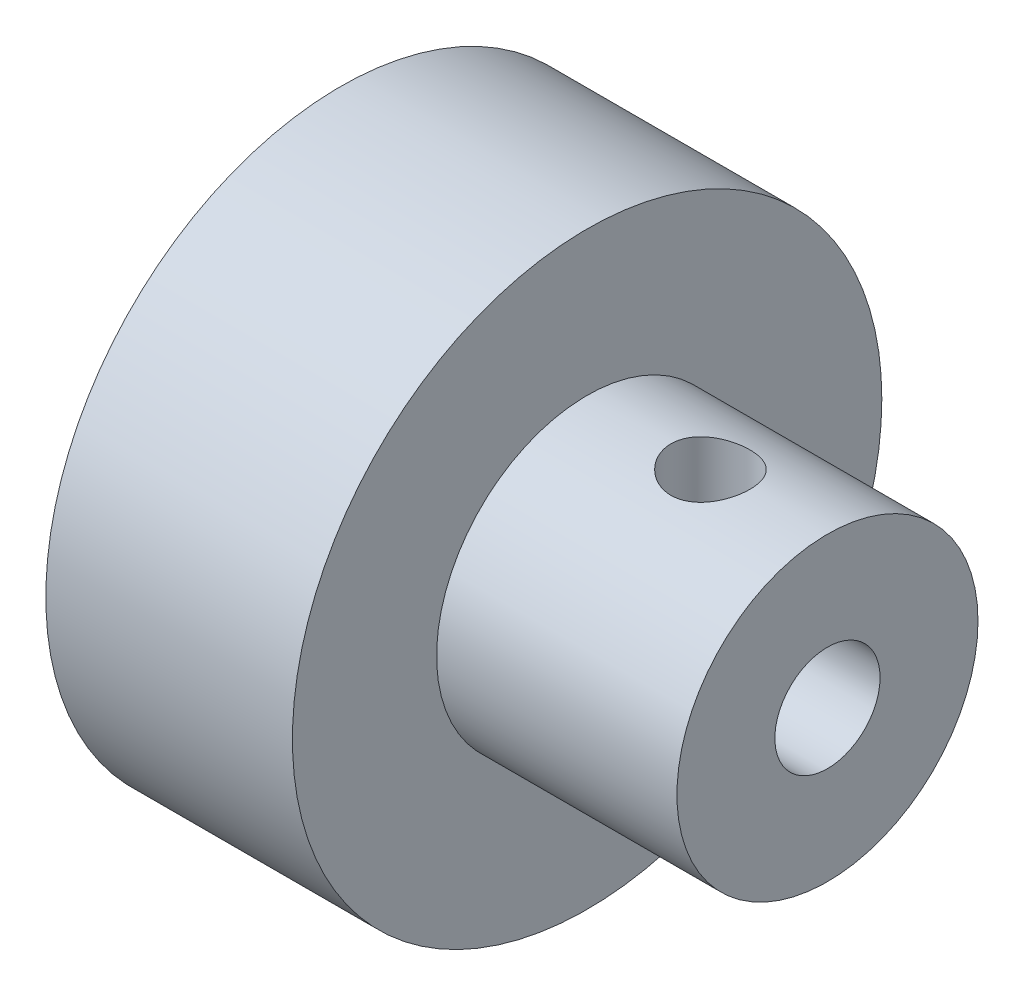
ISO-10303-21;
HEADER;
FILE_DESCRIPTION(('STEP AP214'),'2;1');
FILE_NAME('part.step','',(''),(''),'','','');
FILE_SCHEMA(('AUTOMOTIVE_DESIGN { 1 0 10303 214 1 1 1 1 }'));
ENDSEC;
DATA;
#1=APPLICATION_CONTEXT('core data for automotive mechanical design processes');
#2=APPLICATION_PROTOCOL_DEFINITION('international standard','automotive_design',2000,#1);
#3=PRODUCT_CONTEXT('',#1,'mechanical');
#4=PRODUCT('Part','Part','',(#3));
#5=PRODUCT_RELATED_PRODUCT_CATEGORY('part','',(#4));
#6=PRODUCT_DEFINITION_FORMATION('','',#4);
#7=PRODUCT_DEFINITION_CONTEXT('part definition',#1,'design');
#8=PRODUCT_DEFINITION('design','',#6,#7);
#9=PRODUCT_DEFINITION_SHAPE('','',#8);
#10=(LENGTH_UNIT() NAMED_UNIT(*) SI_UNIT(.MILLI.,.METRE.));
#11=(NAMED_UNIT(*) PLANE_ANGLE_UNIT() SI_UNIT($,.RADIAN.));
#12=(NAMED_UNIT(*) SI_UNIT($,.STERADIAN.) SOLID_ANGLE_UNIT());
#13=UNCERTAINTY_MEASURE_WITH_UNIT(LENGTH_MEASURE(1.E-05),#10,'distance_accuracy_value','');
#14=(GEOMETRIC_REPRESENTATION_CONTEXT(3) GLOBAL_UNCERTAINTY_ASSIGNED_CONTEXT((#13)) GLOBAL_UNIT_ASSIGNED_CONTEXT((#10,
#11,#12)) REPRESENTATION_CONTEXT('',''));
#15=CARTESIAN_POINT('',(0.,0.,0.));
#16=DIRECTION('',(0.,0.,1.));
#17=DIRECTION('',(1.,0.,0.));
#18=AXIS2_PLACEMENT_3D('',#15,#16,#17);
#19=CARTESIAN_POINT('',(-14.6892880689265,0.,0.));
#20=DIRECTION('',(1.,0.,0.));
#21=DIRECTION('',(0.,0.,-1.));
#22=AXIS2_PLACEMENT_3D('',#19,#20,#21);
#23=PLANE('',#22);
#24=CARTESIAN_POINT('',(-14.6892880689265,0.,0.));
#25=DIRECTION('',(1.,0.,0.));
#26=DIRECTION('',(0.,0.,-1.));
#27=AXIS2_PLACEMENT_3D('',#24,#25,#26);
#28=CIRCLE('',#27,8.89);
#29=CARTESIAN_POINT('',(-14.6892880689265,0.,-8.89));
#30=VERTEX_POINT('',#29);
#31=EDGE_CURVE('E122',#30,#30,#28,.T.);
#32=ORIENTED_EDGE('',*,*,#31,.F.);
#33=EDGE_LOOP('',(#32));
#34=FACE_BOUND('',#33,.T.);
#35=CARTESIAN_POINT('',(-14.6892880689265,0.,0.));
#36=DIRECTION('',(1.,0.,0.));
#37=DIRECTION('',(0.,0.,-1.));
#38=AXIS2_PLACEMENT_3D('',#35,#36,#37);
#39=CIRCLE('',#38,1.5875);
#40=CARTESIAN_POINT('',(-14.6892880689265,0.,-1.5875));
#41=VERTEX_POINT('',#40);
#42=EDGE_CURVE('E10',#41,#41,#39,.T.);
#43=ORIENTED_EDGE('',*,*,#42,.T.);
#44=EDGE_LOOP('',(#43));
#45=FACE_BOUND('',#44,.T.);
#46=ADVANCED_FACE('F45',(#34,#45),#23,.F.);
#47=CARTESIAN_POINT('',(0.,0.,0.));
#48=DIRECTION('',(1.,0.,0.));
#49=DIRECTION('',(0.,0.,-1.));
#50=AXIS2_PLACEMENT_3D('',#47,#48,#49);
#51=CYLINDRICAL_SURFACE('',#50,1.5875);
#52=CARTESIAN_POINT('',(-3.52955632665525,-1.05003255157876,1.190625));
#53=CARTESIAN_POINT('',(-3.47399587181116,-1.050045445975,1.19061880120499));
#54=CARTESIAN_POINT('',(-3.41839494567017,-1.05454741000987,1.18668886577821));
#55=CARTESIAN_POINT('',(-3.30942575328898,-1.07148823701036,1.17140301985762));
#56=CARTESIAN_POINT('',(-3.25606464842102,-1.08395075602632,1.16002497361435));
#57=CARTESIAN_POINT('',(-3.15365232330667,-1.11422757784016,1.13096547199778));
#58=CARTESIAN_POINT('',(-3.10455179760005,-1.13196567044321,1.11337314984434));
#59=CARTESIAN_POINT('',(-3.01016962218938,-1.17067373681068,1.0725995764387));
#60=CARTESIAN_POINT('',(-2.96488751182031,-1.19164331985289,1.04941900067592));
#61=CARTESIAN_POINT('',(-2.86906679457896,-1.2396574216291,0.992504284125244));
#62=CARTESIAN_POINT('',(-2.81941365386299,-1.26705442557768,0.957576618231006));
#63=CARTESIAN_POINT('',(-2.72586423782545,-1.321761740015,0.880535424277007));
#64=CARTESIAN_POINT('',(-2.68197661082916,-1.34907186163527,0.83841131436972));
#65=CARTESIAN_POINT('',(-2.59224970284748,-1.40702174808774,0.737878090100433));
#66=CARTESIAN_POINT('',(-2.54784159057137,-1.43720281226121,0.677900035756593));
#67=CARTESIAN_POINT('',(-2.47019994883075,-1.49131980240358,0.548631836139916));
#68=CARTESIAN_POINT('',(-2.43694016553939,-1.51527037067959,0.479364114482458));
#69=CARTESIAN_POINT('',(-2.39194772596979,-1.54808443073509,0.355496037787019));
#70=CARTESIAN_POINT('',(-2.37674788172235,-1.55931958043549,0.302772801943451));
#71=CARTESIAN_POINT('',(-2.35370292208284,-1.57643223525434,0.194907383645006));
#72=CARTESIAN_POINT('',(-2.34585141687053,-1.58231439499439,0.139767346508667));
#73=CARTESIAN_POINT('',(-2.3379615754019,-1.58822529365106,0.0284679172687354));
#74=CARTESIAN_POINT('',(-2.33794354099396,-1.58823882295637,-0.0276937463004187));
#75=CARTESIAN_POINT('',(-2.34577181397461,-1.58237401411808,-0.139157199360015));
#76=CARTESIAN_POINT('',(-2.35361994258859,-1.57649431153499,-0.194458786708892));
#77=CARTESIAN_POINT('',(-2.37630191056096,-1.55965031243376,-0.300743297572916));
#78=CARTESIAN_POINT('',(-2.390887285725,-1.54886705851508,-0.351809262912558));
#79=CARTESIAN_POINT('',(-2.4262403676374,-1.52306558684007,-0.450596385005576));
#80=CARTESIAN_POINT('',(-2.44700942243758,-1.50804644569141,-0.498316809620447));
#81=CARTESIAN_POINT('',(-2.49651420867685,-1.472890802502,-0.594690931730129));
#82=CARTESIAN_POINT('',(-2.52586905334639,-1.45237629107677,-0.642886211616418));
#83=CARTESIAN_POINT('',(-2.59033870418185,-1.40859432596468,-0.733875255122699));
#84=CARTESIAN_POINT('',(-2.62545841877955,-1.38532453106985,-0.776664360293093));
#85=CARTESIAN_POINT('',(-2.70820235978188,-1.33265676661185,-0.864458871498921));
#86=CARTESIAN_POINT('',(-2.75692738711371,-1.30295376843929,-0.908244413225473));
#87=CARTESIAN_POINT('',(-2.86108752740517,-1.24401229387742,-0.987431949727556));
#88=CARTESIAN_POINT('',(-2.91652581815327,-1.21477404494797,-1.0228299505536));
#89=CARTESIAN_POINT('',(-3.02233568616272,-1.16537919386833,-1.07849357589208));
#90=CARTESIAN_POINT('',(-3.07155229386264,-1.14456844833299,-1.10036663076556));
#91=CARTESIAN_POINT('',(-3.17400814378189,-1.10757288373056,-1.13759771455097));
#92=CARTESIAN_POINT('',(-3.22723796990948,-1.09137763785656,-1.15297046685305));
#93=CARTESIAN_POINT('',(-3.32610783845392,-1.06870540179809,-1.17397518372094));
#94=CARTESIAN_POINT('',(-3.37116119808551,-1.06093847023265,-1.18093386412912));
#95=CARTESIAN_POINT('',(-3.46236972793073,-1.05120748322927,-1.18960709991958));
#96=CARTESIAN_POINT('',(-3.50852341207812,-1.04923600365031,-1.19132836468154));
#97=CARTESIAN_POINT('',(-3.60058027634364,-1.05142402102457,-1.18939683154219));
#98=CARTESIAN_POINT('',(-3.64648335801668,-1.05558577464436,-1.1857420555772));
#99=CARTESIAN_POINT('',(-3.73678552265678,-1.06934967402693,-1.17334131022126));
#100=CARTESIAN_POINT('',(-3.78118190127656,-1.0789611050858,-1.16458665082263));
#101=CARTESIAN_POINT('',(-3.88383714982548,-1.10670783140942,-1.13834830402645));
#102=CARTESIAN_POINT('',(-3.94106486507531,-1.12668703809744,-1.11882388129336));
#103=CARTESIAN_POINT('',(-4.05050053466959,-1.1710817723223,-1.07226796784258));
#104=CARTESIAN_POINT('',(-4.10269900600796,-1.19550543916301,-1.04522265503785));
#105=CARTESIAN_POINT('',(-4.20372710179345,-1.24704699135672,-0.983216332051275));
#106=CARTESIAN_POINT('',(-4.25237117215349,-1.27422976552798,-0.948008248603961));
#107=CARTESIAN_POINT('',(-4.34394549064199,-1.32832083103686,-0.870605343134578));
#108=CARTESIAN_POINT('',(-4.38687294449647,-1.3552289822489,-0.828407126793555));
#109=CARTESIAN_POINT('',(-4.47513243876106,-1.41255926707429,-0.727261145352264));
#110=CARTESIAN_POINT('',(-4.51894604749847,-1.44246738243752,-0.666667665064069));
#111=CARTESIAN_POINT('',(-4.59526153383188,-1.49584651911049,-0.536219092541945));
#112=CARTESIAN_POINT('',(-4.62778789366665,-1.519331448665,-0.46638450504254));
#113=CARTESIAN_POINT('',(-4.6713164823662,-1.55114153831888,-0.341912306313174));
#114=CARTESIAN_POINT('',(-4.68585703131764,-1.56190535686026,-0.289123483003683));
#115=CARTESIAN_POINT('',(-4.70758355872435,-1.57805648311366,-0.181264294065456));
#116=CARTESIAN_POINT('',(-4.71477611263438,-1.58344859766149,-0.126196014246044));
#117=CARTESIAN_POINT('',(-4.72138496195483,-1.58840143581668,-0.0151984122151932));
#118=CARTESIAN_POINT('',(-4.72078300292542,-1.58794847048757,0.040732624740999));
#119=CARTESIAN_POINT('',(-4.7117985398099,-1.58121987574774,0.151613402505125));
#120=CARTESIAN_POINT('',(-4.70341396297494,-1.57494269517078,0.206562877919334));
#121=CARTESIAN_POINT('',(-4.67971998694751,-1.55736449484373,0.312358036108632));
#122=CARTESIAN_POINT('',(-4.66461868273127,-1.54621460816847,0.363276543980955));
#123=CARTESIAN_POINT('',(-4.62827454957022,-1.51973534456514,0.461693691083551));
#124=CARTESIAN_POINT('',(-4.60703040691447,-1.50440507365769,0.50919159606487));
#125=CARTESIAN_POINT('',(-4.55644821368846,-1.46857753504696,0.605272235896156));
#126=CARTESIAN_POINT('',(-4.52646589988858,-1.44769167461642,0.653368356641274));
#127=CARTESIAN_POINT('',(-4.46073108946535,-1.403234954476,0.744073006806094));
#128=CARTESIAN_POINT('',(-4.42497328955946,-1.37966163294053,0.786676427329301));
#129=CARTESIAN_POINT('',(-4.34076456694763,-1.32640667727172,0.874017021494155));
#130=CARTESIAN_POINT('',(-4.29120199709983,-1.29643919738103,0.917509051614588));
#131=CARTESIAN_POINT('',(-4.18529854458473,-1.2371870295527,0.995959824095465));
#132=CARTESIAN_POINT('',(-4.12895518973873,-1.20790259531751,1.03091544004403));
#133=CARTESIAN_POINT('',(-4.0225677464992,-1.15926871150369,1.0850242722053));
#134=CARTESIAN_POINT('',(-3.97379043413193,-1.13913939849811,1.10595986530786));
#135=CARTESIAN_POINT('',(-3.87239051441715,-1.10357098191916,1.14145534685201));
#136=CARTESIAN_POINT('',(-3.81977855895137,-1.08811945745383,1.15603216594685));
#137=CARTESIAN_POINT('',(-3.72736817735019,-1.06785111060464,1.17472664594127));
#138=CARTESIAN_POINT('',(-3.68833246381845,-1.06124478398383,1.18065747665075));
#139=CARTESIAN_POINT('',(-3.60938984980979,-1.05233228217761,1.18860759763756));
#140=CARTESIAN_POINT('',(-3.56948353840617,-1.05002328532471,1.19062945461798));
#141=CARTESIAN_POINT('',(-3.52955632665525,-1.05003255157876,1.190625));
#142=B_SPLINE_CURVE_WITH_KNOTS('',3,(#52,#53,#54,#55,#56,#57,#58,#59,#60,#61,#62,#63,#64,#65,
#66,#67,#68,#69,#70,#71,#72,#73,#74,#75,#76,#77,#78,#79,#80,#81,#82,#83,#84,#85,#86,#87,#88,#89,
#90,#91,#92,#93,#94,#95,#96,#97,#98,#99,#100,#101,#102,#103,#104,#105,#106,#107,#108,#109,#110,
#111,#112,#113,#114,#115,#116,#117,#118,#119,#120,#121,#122,#123,#124,#125,#126,#127,#128,#129,
#130,#131,#132,#133,#134,#135,#136,#137,#138,#139,#140,#141),.UNSPECIFIED.,.T.,.F.,(4,2,2,2,2,2,
2,2,2,2,2,2,2,2,2,2,2,2,2,2,2,2,2,2,2,2,2,2,2,2,2,2,2,2,2,2,2,2,2,2,2,2,2,2,4),(0.,
0.166474597743314,0.333446217300251,0.498114149835984,0.662762187833673,0.861895093986152,
1.0613233713153,1.30147098182183,1.54104901534439,1.70837006939059,1.87554549222377,
2.04315417765196,2.21080167790273,2.37270731241696,2.53464826848756,2.71412370017785,
2.89375274442082,3.10871804281232,3.32378549783047,3.49646406272525,3.66874938249073,
3.80688854402059,3.9448506680219,4.08286356658931,4.22111232464965,4.41110709885653,
4.60145338469826,4.79856172215235,4.99576605498253,5.23599171487223,5.47569301565586,
5.64239486354326,5.80894740496725,5.97589007623953,6.14287722220568,6.30501670074205,
6.46719088019845,6.64773604163628,6.82844793934811,7.0449089208391,7.26144906140521,
7.43123259464913,7.6005612670708,7.72027294583552,7.83990599300725),.UNSPECIFIED.);
#143=CARTESIAN_POINT('',(-3.52955632665525,-1.05003255157876,1.190625));
#144=VERTEX_POINT('',#143);
#145=EDGE_CURVE('E95',#144,#144,#142,.T.);
#146=ORIENTED_EDGE('',*,*,#145,.F.);
#147=EDGE_LOOP('',(#146));
#148=FACE_BOUND('',#147,.T.);
#149=CARTESIAN_POINT('',(-3.52955632665525,1.05003255157876,1.190625));
#150=CARTESIAN_POINT('',(-3.58511678149935,1.050045445975,1.19061880120499));
#151=CARTESIAN_POINT('',(-3.64071770764034,1.05454741000987,1.18668886577821));
#152=CARTESIAN_POINT('',(-3.74968690002153,1.07148823701036,1.17140301985762));
#153=CARTESIAN_POINT('',(-3.80304800488949,1.08395075602632,1.16002497361435));
#154=CARTESIAN_POINT('',(-3.90546033000384,1.11422757784016,1.13096547199778));
#155=CARTESIAN_POINT('',(-3.95456085571046,1.13196567044321,1.11337314984434));
#156=CARTESIAN_POINT('',(-4.04894303112113,1.17067373681068,1.0725995764387));
#157=CARTESIAN_POINT('',(-4.0942251414902,1.19164331985289,1.04941900067592));
#158=CARTESIAN_POINT('',(-4.19004585873155,1.2396574216291,0.992504284125244));
#159=CARTESIAN_POINT('',(-4.23969899944752,1.26705442557768,0.957576618231007));
#160=CARTESIAN_POINT('',(-4.33324841548505,1.321761740015,0.880535424277007));
#161=CARTESIAN_POINT('',(-4.37713604248134,1.34907186163527,0.83841131436972));
#162=CARTESIAN_POINT('',(-4.46686295046303,1.40702174808774,0.737878090100434));
#163=CARTESIAN_POINT('',(-4.51127106273914,1.43720281226121,0.677900035756593));
#164=CARTESIAN_POINT('',(-4.58891270447975,1.49131980240358,0.548631836139916));
#165=CARTESIAN_POINT('',(-4.62217248777112,1.51527037067959,0.479364114482458));
#166=CARTESIAN_POINT('',(-4.66716492734071,1.54808443073509,0.355496037787019));
#167=CARTESIAN_POINT('',(-4.68236477158816,1.55931958043549,0.302772801943451));
#168=CARTESIAN_POINT('',(-4.70540973122767,1.57643223525434,0.194907383645006));
#169=CARTESIAN_POINT('',(-4.71326123643998,1.58231439499439,0.139767346508666));
#170=CARTESIAN_POINT('',(-4.72115107790861,1.58822529365106,0.0284679172687352));
#171=CARTESIAN_POINT('',(-4.72116911231655,1.58823882295637,-0.0276937463004189));
#172=CARTESIAN_POINT('',(-4.7133408393359,1.58237401411808,-0.139157199360016));
#173=CARTESIAN_POINT('',(-4.70549271072191,1.57649431153499,-0.194458786708892));
#174=CARTESIAN_POINT('',(-4.68281074274955,1.55965031243376,-0.300743297572916));
#175=CARTESIAN_POINT('',(-4.66822536758551,1.54886705851508,-0.351809262912558));
#176=CARTESIAN_POINT('',(-4.63287228567311,1.52306558684007,-0.450596385005576));
#177=CARTESIAN_POINT('',(-4.61210323087293,1.50804644569141,-0.498316809620447));
#178=CARTESIAN_POINT('',(-4.56259844463366,1.472890802502,-0.594690931730128));
#179=CARTESIAN_POINT('',(-4.53324359996412,1.45237629107677,-0.642886211616417));
#180=CARTESIAN_POINT('',(-4.46877394912866,1.40859432596468,-0.733875255122699));
#181=CARTESIAN_POINT('',(-4.43365423453096,1.38532453106985,-0.776664360293093));
#182=CARTESIAN_POINT('',(-4.35091029352863,1.33265676661185,-0.86445887149892));
#183=CARTESIAN_POINT('',(-4.3021852661968,1.30295376843929,-0.908244413225473));
#184=CARTESIAN_POINT('',(-4.19802512590534,1.24401229387742,-0.987431949727557));
#185=CARTESIAN_POINT('',(-4.14258683515724,1.21477404494797,-1.0228299505536));
#186=CARTESIAN_POINT('',(-4.03677696714779,1.16537919386833,-1.07849357589208));
#187=CARTESIAN_POINT('',(-3.98756035944787,1.14456844833299,-1.10036663076556));
#188=CARTESIAN_POINT('',(-3.88510450952862,1.10757288373056,-1.13759771455097));
#189=CARTESIAN_POINT('',(-3.83187468340103,1.09137763785656,-1.15297046685305));
#190=CARTESIAN_POINT('',(-3.73300481485659,1.06870540179809,-1.17397518372094));
#191=CARTESIAN_POINT('',(-3.687951455225,1.06093847023265,-1.18093386412912));
#192=CARTESIAN_POINT('',(-3.59674292537978,1.05120748322927,-1.18960709991958));
#193=CARTESIAN_POINT('',(-3.55058924123239,1.04923600365031,-1.19132836468154));
#194=CARTESIAN_POINT('',(-3.45853237696687,1.05142402102457,-1.18939683154219));
#195=CARTESIAN_POINT('',(-3.41262929529383,1.05558577464436,-1.1857420555772));
#196=CARTESIAN_POINT('',(-3.32232713065373,1.06934967402693,-1.17334131022126));
#197=CARTESIAN_POINT('',(-3.27793075203395,1.0789611050858,-1.16458665082263));
#198=CARTESIAN_POINT('',(-3.17527550348503,1.10670783140942,-1.13834830402645));
#199=CARTESIAN_POINT('',(-3.1180477882352,1.12668703809744,-1.11882388129336));
#200=CARTESIAN_POINT('',(-3.00861211864092,1.1710817723223,-1.07226796784258));
#201=CARTESIAN_POINT('',(-2.95641364730255,1.19550543916301,-1.04522265503785));
#202=CARTESIAN_POINT('',(-2.85538555151706,1.24704699135672,-0.983216332051275));
#203=CARTESIAN_POINT('',(-2.80674148115702,1.27422976552798,-0.948008248603961));
#204=CARTESIAN_POINT('',(-2.71516716266852,1.32832083103686,-0.870605343134578));
#205=CARTESIAN_POINT('',(-2.67223970881404,1.3552289822489,-0.828407126793555));
#206=CARTESIAN_POINT('',(-2.58398021454945,1.41255926707429,-0.727261145352264));
#207=CARTESIAN_POINT('',(-2.54016660581204,1.44246738243751,-0.66666766506407));
#208=CARTESIAN_POINT('',(-2.46385111947863,1.49584651911049,-0.536219092541946));
#209=CARTESIAN_POINT('',(-2.43132475964385,1.519331448665,-0.466384505042541));
#210=CARTESIAN_POINT('',(-2.3877961709443,1.55114153831888,-0.341912306313175));
#211=CARTESIAN_POINT('',(-2.37325562199287,1.56190535686026,-0.289123483003684));
#212=CARTESIAN_POINT('',(-2.35152909458616,1.57805648311366,-0.181264294065457));
#213=CARTESIAN_POINT('',(-2.34433654067613,1.58344859766149,-0.126196014246045));
#214=CARTESIAN_POINT('',(-2.33772769135568,1.58840143581668,-0.0151984122151944));
#215=CARTESIAN_POINT('',(-2.33832965038508,1.58794847048757,0.0407326247409978));
#216=CARTESIAN_POINT('',(-2.34731411350061,1.58121987574774,0.151613402505124));
#217=CARTESIAN_POINT('',(-2.35569869033556,1.57494269517078,0.206562877919333));
#218=CARTESIAN_POINT('',(-2.379392666363,1.55736449484374,0.312358036108631));
#219=CARTESIAN_POINT('',(-2.39449397057923,1.54621460816847,0.363276543980954));
#220=CARTESIAN_POINT('',(-2.43083810374029,1.51973534456514,0.46169369108355));
#221=CARTESIAN_POINT('',(-2.45208224639604,1.50440507365769,0.509191596064869));
#222=CARTESIAN_POINT('',(-2.50266443962205,1.46857753504696,0.605272235896155));
#223=CARTESIAN_POINT('',(-2.53264675342192,1.44769167461642,0.653368356641273));
#224=CARTESIAN_POINT('',(-2.59838156384516,1.403234954476,0.744073006806093));
#225=CARTESIAN_POINT('',(-2.63413936375105,1.37966163294053,0.7866764273293));
#226=CARTESIAN_POINT('',(-2.71834808636288,1.32640667727172,0.874017021494154));
#227=CARTESIAN_POINT('',(-2.76791065621068,1.29643919738103,0.917509051614587));
#228=CARTESIAN_POINT('',(-2.87381410872578,1.2371870295527,0.995959824095464));
#229=CARTESIAN_POINT('',(-2.93015746357177,1.20790259531751,1.03091544004403));
#230=CARTESIAN_POINT('',(-3.03654490681131,1.15926871150369,1.0850242722053));
#231=CARTESIAN_POINT('',(-3.08532221917858,1.13913939849812,1.10595986530786));
#232=CARTESIAN_POINT('',(-3.18672213889336,1.10357098191916,1.14145534685201));
#233=CARTESIAN_POINT('',(-3.23933409435914,1.08811945745383,1.15603216594685));
#234=CARTESIAN_POINT('',(-3.33174447596032,1.06785111060464,1.17472664594127));
#235=CARTESIAN_POINT('',(-3.37078018949206,1.06124478398383,1.18065747665075));
#236=CARTESIAN_POINT('',(-3.44972280350072,1.05233228217761,1.18860759763756));
#237=CARTESIAN_POINT('',(-3.48962911490434,1.05002328532471,1.19062945461798));
#238=CARTESIAN_POINT('',(-3.52955632665525,1.05003255157876,1.190625));
#239=B_SPLINE_CURVE_WITH_KNOTS('',3,(#149,#150,#151,#152,#153,#154,#155,#156,#157,#158,#159,
#160,#161,#162,#163,#164,#165,#166,#167,#168,#169,#170,#171,#172,#173,#174,#175,#176,#177,#178,
#179,#180,#181,#182,#183,#184,#185,#186,#187,#188,#189,#190,#191,#192,#193,#194,#195,#196,#197,
#198,#199,#200,#201,#202,#203,#204,#205,#206,#207,#208,#209,#210,#211,#212,#213,#214,#215,#216,
#217,#218,#219,#220,#221,#222,#223,#224,#225,#226,#227,#228,#229,#230,#231,#232,#233,#234,#235,
#236,#237,#238),.UNSPECIFIED.,.T.,.F.,(4,2,2,2,2,2,2,2,2,2,2,2,2,2,2,2,2,2,2,2,2,2,2,2,2,2,2,2,
2,2,2,2,2,2,2,2,2,2,2,2,2,2,2,2,4),(0.,0.166474597743314,0.333446217300251,0.498114149835984,
0.662762187833672,0.861895093986151,1.0613233713153,1.30147098182183,1.5410490153444,
1.70837006939059,1.87554549222377,2.04315417765196,2.21080167790273,2.37270731241696,
2.53464826848756,2.71412370017785,2.89375274442082,3.10871804281232,3.32378549783047,
3.49646406272525,3.66874938249073,3.80688854402059,3.9448506680219,4.08286356658931,
4.22111232464965,4.41110709885653,4.60145338469826,4.79856172215235,4.99576605498252,
5.23599171487223,5.47569301565586,5.64239486354326,5.80894740496724,5.97589007623953,
6.14287722220568,6.30501670074205,6.46719088019845,6.64773604163628,6.82844793934811,
7.0449089208391,7.26144906140521,7.43123259464912,7.60056126707079,7.72027294583552,
7.83990599300725),.UNSPECIFIED.);
#240=CARTESIAN_POINT('',(-3.52955632665525,1.05003255157876,1.190625));
#241=VERTEX_POINT('',#240);
#242=EDGE_CURVE('E89',#241,#241,#239,.T.);
#243=ORIENTED_EDGE('',*,*,#242,.F.);
#244=EDGE_LOOP('',(#243));
#245=FACE_BOUND('',#244,.T.);
#246=CARTESIAN_POINT('',(0.,0.,0.));
#247=DIRECTION('',(1.,0.,0.));
#248=DIRECTION('',(0.,0.,-1.));
#249=AXIS2_PLACEMENT_3D('',#246,#247,#248);
#250=CIRCLE('',#249,1.5875);
#251=CARTESIAN_POINT('',(0.,0.,-1.5875));
#252=VERTEX_POINT('',#251);
#253=EDGE_CURVE('E58',#252,#252,#250,.T.);
#254=ORIENTED_EDGE('',*,*,#253,.T.);
#255=EDGE_LOOP('',(#254));
#256=FACE_BOUND('',#255,.T.);
#257=ORIENTED_EDGE('',*,*,#42,.F.);
#258=EDGE_LOOP('',(#257));
#259=FACE_BOUND('',#258,.T.);
#260=ADVANCED_FACE('F100',(#148,#245,#256,#259),#51,.F.);
#261=CARTESIAN_POINT('',(0.,0.,0.));
#262=DIRECTION('',(1.,0.,0.));
#263=DIRECTION('',(0.,0.,-1.));
#264=AXIS2_PLACEMENT_3D('',#261,#262,#263);
#265=PLANE('',#264);
#266=CARTESIAN_POINT('',(0.,0.,0.));
#267=DIRECTION('',(1.,0.,0.));
#268=DIRECTION('',(0.,0.,-1.));
#269=AXIS2_PLACEMENT_3D('',#266,#267,#268);
#270=CIRCLE('',#269,4.540976685);
#271=CARTESIAN_POINT('',(0.,0.,-4.540976685));
#272=VERTEX_POINT('',#271);
#273=EDGE_CURVE('E64',#272,#272,#270,.T.);
#274=ORIENTED_EDGE('',*,*,#273,.T.);
#275=EDGE_LOOP('',(#274));
#276=FACE_BOUND('',#275,.T.);
#277=ORIENTED_EDGE('',*,*,#253,.F.);
#278=EDGE_LOOP('',(#277));
#279=FACE_BOUND('',#278,.T.);
#280=ADVANCED_FACE('F103',(#276,#279),#265,.T.);
#281=CARTESIAN_POINT('',(0.,0.,0.));
#282=DIRECTION('',(1.,0.,0.));
#283=DIRECTION('',(0.,0.,-1.));
#284=AXIS2_PLACEMENT_3D('',#281,#282,#283);
#285=CYLINDRICAL_SURFACE('',#284,4.540976685);
#286=CARTESIAN_POINT('',(-3.52955632665525,-4.38210923678182,1.190625));
#287=CARTESIAN_POINT('',(-3.59518874621364,-4.382110411529,1.19062333601383));
#288=CARTESIAN_POINT('',(-3.66083898920146,-4.38359985154138,1.18517959598356));
#289=CARTESIAN_POINT('',(-3.79024643109953,-4.38937957928712,1.16358793544736));
#290=CARTESIAN_POINT('',(-3.85400262067081,-4.39367133333952,1.14743441094717));
#291=CARTESIAN_POINT('',(-3.97773128590979,-4.40453695340578,1.10498827781711));
#292=CARTESIAN_POINT('',(-4.03770883052681,-4.4111076817405,1.07870960394871));
#293=CARTESIAN_POINT('',(-4.15241255686503,-4.42578692036885,1.01680245905003));
#294=CARTESIAN_POINT('',(-4.20713838035359,-4.43389553545334,0.981173350822169));
#295=CARTESIAN_POINT('',(-4.31110884505642,-4.45095661579317,0.900655511166977));
#296=CARTESIAN_POINT('',(-4.36020767651315,-4.4599236428761,0.855581546776054));
#297=CARTESIAN_POINT('',(-4.4502426623318,-4.47756533004064,0.757852019826672));
#298=CARTESIAN_POINT('',(-4.49117799380518,-4.48623996057524,0.705195693879306));
#299=CARTESIAN_POINT('',(-4.56432885516231,-4.50248157371674,0.592788432603376));
#300=CARTESIAN_POINT('',(-4.59639989716615,-4.51002937311624,0.53294045717722));
#301=CARTESIAN_POINT('',(-4.64997027988811,-4.52300007053577,0.408471295446384));
#302=CARTESIAN_POINT('',(-4.67147134179227,-4.52842331448325,0.343850888243683));
#303=CARTESIAN_POINT('',(-4.70282085780257,-4.53643088875381,0.213192650251077));
#304=CARTESIAN_POINT('',(-4.71291723004802,-4.53907552811133,0.147218064417753));
#305=CARTESIAN_POINT('',(-4.72195027144157,-4.54143858461819,0.0144620652906807));
#306=CARTESIAN_POINT('',(-4.72088874865133,-4.54115747586535,-0.0523192155318259));
#307=CARTESIAN_POINT('',(-4.70781173881385,-4.53774509118645,-0.183069008937438));
#308=CARTESIAN_POINT('',(-4.69606403645598,-4.5346834944265,-0.247066399181627));
#309=CARTESIAN_POINT('',(-4.66238015845805,-4.52613605963321,-0.372147638438734));
#310=CARTESIAN_POINT('',(-4.64044341182494,-4.52065008573886,-0.433231323956351));
#311=CARTESIAN_POINT('',(-4.58679579737687,-4.50776606581912,-0.551440807528402));
#312=CARTESIAN_POINT('',(-4.55499221074429,-4.50034999391617,-0.60852248108443));
#313=CARTESIAN_POINT('',(-4.48258463556712,-4.48440631981034,-0.716630717668735));
#314=CARTESIAN_POINT('',(-4.44197898141288,-4.47587850735542,-0.767656131842963));
#315=CARTESIAN_POINT('',(-4.35169451930614,-4.45833804199545,-0.863801472009694));
#316=CARTESIAN_POINT('',(-4.30178202296194,-4.44931851173676,-0.908700950962842));
#317=CARTESIAN_POINT('',(-4.19504218819437,-4.43204061721953,-0.989544828420986));
#318=CARTESIAN_POINT('',(-4.13821445685296,-4.42378229625919,-1.02548871772271));
#319=CARTESIAN_POINT('',(-4.0187918201317,-4.40893505548777,-1.08756151569407));
#320=CARTESIAN_POINT('',(-3.95616543112838,-4.40235607725121,-1.11363239707877));
#321=CARTESIAN_POINT('',(-3.82720331010267,-4.39173695976952,-1.15480421936248));
#322=CARTESIAN_POINT('',(-3.76086846700663,-4.38769621492052,-1.16990777711874));
#323=CARTESIAN_POINT('',(-3.62842938914979,-4.38273957437786,-1.1883401140066));
#324=CARTESIAN_POINT('',(-3.5623740162916,-4.38173664682477,-1.19199694133505));
#325=CARTESIAN_POINT('',(-3.43059597174308,-4.38273141044292,-1.1883342773215));
#326=CARTESIAN_POINT('',(-3.36487326666748,-4.38472879427369,-1.18101591023676));
#327=CARTESIAN_POINT('',(-3.23687750277637,-4.39141524160478,-1.15589938087181));
#328=CARTESIAN_POINT('',(-3.17456320386718,-4.39605405449211,-1.13829670907073));
#329=CARTESIAN_POINT('',(-3.0537709849105,-4.40745196944762,-1.09333020995518));
#330=CARTESIAN_POINT('',(-2.99529355452307,-4.41421134150702,-1.06596513962374));
#331=CARTESIAN_POINT('',(-2.88245774999596,-4.42926865847676,-1.00157901179672));
#332=CARTESIAN_POINT('',(-2.82821390712529,-4.43759635838958,-0.96436435715435));
#333=CARTESIAN_POINT('',(-2.72662050063934,-4.4547811915853,-0.881576736977689));
#334=CARTESIAN_POINT('',(-2.67927219109868,-4.46363842076035,-0.83600225445792));
#335=CARTESIAN_POINT('',(-2.59146116088678,-4.48118267155809,-0.736274532516875));
#336=CARTESIAN_POINT('',(-2.55122670873598,-4.48985809832908,-0.681917862604236));
#337=CARTESIAN_POINT('',(-2.48045449018373,-4.50580773338818,-0.567030999583258));
#338=CARTESIAN_POINT('',(-2.44991620891345,-4.51308201606928,-0.506501134498532));
#339=CARTESIAN_POINT('',(-2.39967986738235,-4.52536303635212,-0.38141121169122));
#340=CARTESIAN_POINT('',(-2.3799015171163,-4.53038651816167,-0.316885121425806));
#341=CARTESIAN_POINT('',(-2.3515111101863,-4.53767352052458,-0.185274367542867));
#342=CARTESIAN_POINT('',(-2.34289666726882,-4.53993763087958,-0.118190253852417));
#343=CARTESIAN_POINT('',(-2.33722395118107,-4.54142396759846,0.0144964977388596));
#344=CARTESIAN_POINT('',(-2.33983029504295,-4.54073447849475,0.0800840148313264));
#345=CARTESIAN_POINT('',(-2.35574933121636,-4.5365896769167,0.209852517118681));
#346=CARTESIAN_POINT('',(-2.3690616451451,-4.53313446219186,0.274033551940743));
#347=CARTESIAN_POINT('',(-2.4058276802666,-4.52386292191343,0.398778094695483));
#348=CARTESIAN_POINT('',(-2.42921536894912,-4.51806198480748,0.459362283598971));
#349=CARTESIAN_POINT('',(-2.48540911672086,-4.50470671194395,0.575781214551999));
#350=CARTESIAN_POINT('',(-2.51821646193451,-4.49715213677824,0.631615306690832));
#351=CARTESIAN_POINT('',(-2.59331112483599,-4.48085500984197,0.738518543831353));
#352=CARTESIAN_POINT('',(-2.63582224669521,-4.47208672845935,0.789426546587598));
#353=CARTESIAN_POINT('',(-2.728690509751,-4.45445763455913,0.883499857228881));
#354=CARTESIAN_POINT('',(-2.77904969083899,-4.4455967985447,0.926663145791303));
#355=CARTESIAN_POINT('',(-2.88746075895938,-4.42857162935135,1.00491977862249));
#356=CARTESIAN_POINT('',(-2.94565231920815,-4.42042589457242,1.03982402536919));
#357=CARTESIAN_POINT('',(-3.06728392280068,-4.40601226255356,1.09930348050139));
#358=CARTESIAN_POINT('',(-3.13072039109517,-4.39974309944876,1.12388565629776));
#359=CARTESIAN_POINT('',(-3.24989084533458,-4.39069313400181,1.15868307873649));
#360=CARTESIAN_POINT('',(-3.30509291309917,-4.38749970789624,1.17063373938465));
#361=CARTESIAN_POINT('',(-3.41671112352313,-4.38320736480167,1.18660499688162));
#362=CARTESIAN_POINT('',(-3.47312713741569,-4.38210822676221,1.19062643065563));
#363=CARTESIAN_POINT('',(-3.52955632665525,-4.38210923678182,1.190625));
#364=B_SPLINE_CURVE_WITH_KNOTS('',3,(#286,#287,#288,#289,#290,#291,#292,#293,#294,#295,#296,
#297,#298,#299,#300,#301,#302,#303,#304,#305,#306,#307,#308,#309,#310,#311,#312,#313,#314,#315,
#316,#317,#318,#319,#320,#321,#322,#323,#324,#325,#326,#327,#328,#329,#330,#331,#332,#333,#334,
#335,#336,#337,#338,#339,#340,#341,#342,#343,#344,#345,#346,#347,#348,#349,#350,#351,#352,#353,
#354,#355,#356,#357,#358,#359,#360,#361,#362,#363),.UNSPECIFIED.,.T.,.F.,(4,2,2,2,2,2,2,2,2,2,2,
2,2,2,2,2,2,2,2,2,2,2,2,2,2,2,2,2,2,2,2,2,2,2,2,2,2,2,4),(0.,0.19668983626948,0.393482673636953,
0.590005636246095,0.786541994648917,0.987370639878999,1.18821951860617,1.39217142358591,
1.59609010659715,1.79548509561864,1.99484777452484,2.18934825073578,2.38385962804985,
2.58025722206466,2.77669201276442,2.9789619066041,3.1812432986257,3.38469577259195,
3.58809968583356,3.78561828984414,3.98311666218048,4.17697767384545,4.37086337806775,
4.5688866103753,4.76694581185336,4.97051639544768,5.17407616759036,5.37609539386188,
5.57807143197123,5.77405310776749,5.97002785725674,6.16473730391064,6.35947334811161,
6.55926007442205,6.75909881678437,6.96314617434015,7.1670555773992,7.33618266049872,
7.50529189137928),.UNSPECIFIED.);
#365=CARTESIAN_POINT('',(-3.52955632665525,-4.38210923678182,1.190625));
#366=VERTEX_POINT('',#365);
#367=EDGE_CURVE('E48',#366,#366,#364,.T.);
#368=ORIENTED_EDGE('',*,*,#367,.F.);
#369=EDGE_LOOP('',(#368));
#370=FACE_BOUND('',#369,.T.);
#371=CARTESIAN_POINT('',(-3.52955632665525,4.38210923678182,1.190625));
#372=CARTESIAN_POINT('',(-3.46392390709687,4.382110411529,1.19062333601383));
#373=CARTESIAN_POINT('',(-3.39827366410905,4.38359985154138,1.18517959598356));
#374=CARTESIAN_POINT('',(-3.26886622221097,4.38937957928712,1.16358793544736));
#375=CARTESIAN_POINT('',(-3.2051100326397,4.39367133333952,1.14743441094717));
#376=CARTESIAN_POINT('',(-3.08138136740072,4.40453695340578,1.10498827781711));
#377=CARTESIAN_POINT('',(-3.0214038227837,4.4111076817405,1.07870960394871));
#378=CARTESIAN_POINT('',(-2.90670009644548,4.42578692036885,1.01680245905003));
#379=CARTESIAN_POINT('',(-2.85197427295692,4.43389553545334,0.981173350822169));
#380=CARTESIAN_POINT('',(-2.74800380825409,4.45095661579317,0.900655511166977));
#381=CARTESIAN_POINT('',(-2.69890497679736,4.4599236428761,0.855581546776053));
#382=CARTESIAN_POINT('',(-2.60886999097871,4.47756533004064,0.757852019826671));
#383=CARTESIAN_POINT('',(-2.56793465950533,4.48623996057524,0.705195693879305));
#384=CARTESIAN_POINT('',(-2.4947837981482,4.50248157371674,0.592788432603376));
#385=CARTESIAN_POINT('',(-2.46271275614436,4.51002937311624,0.532940457177219));
#386=CARTESIAN_POINT('',(-2.4091423734224,4.52300007053577,0.408471295446383));
#387=CARTESIAN_POINT('',(-2.38764131151824,4.52842331448325,0.343850888243683));
#388=CARTESIAN_POINT('',(-2.35629179550794,4.53643088875381,0.213192650251077));
#389=CARTESIAN_POINT('',(-2.34619542326249,4.53907552811133,0.147218064417753));
#390=CARTESIAN_POINT('',(-2.33716238186894,4.54143858461819,0.0144620652906806));
#391=CARTESIAN_POINT('',(-2.33822390465918,4.54115747586535,-0.0523192155318261));
#392=CARTESIAN_POINT('',(-2.35130091449666,4.53774509118645,-0.183069008937438));
#393=CARTESIAN_POINT('',(-2.36304861685453,4.5346834944265,-0.247066399181627));
#394=CARTESIAN_POINT('',(-2.39673249485246,4.52613605963321,-0.372147638438734));
#395=CARTESIAN_POINT('',(-2.41866924148557,4.52065008573886,-0.433231323956351));
#396=CARTESIAN_POINT('',(-2.47231685593364,4.50776606581912,-0.551440807528402));
#397=CARTESIAN_POINT('',(-2.50412044256622,4.50034999391617,-0.608522481084431));
#398=CARTESIAN_POINT('',(-2.57652801774339,4.48440631981034,-0.716630717668736));
#399=CARTESIAN_POINT('',(-2.61713367189763,4.47587850735542,-0.767656131842963));
#400=CARTESIAN_POINT('',(-2.70741813400437,4.45833804199545,-0.863801472009693));
#401=CARTESIAN_POINT('',(-2.75733063034857,4.44931851173676,-0.908700950962841));
#402=CARTESIAN_POINT('',(-2.86407046511614,4.43204061721953,-0.989544828420985));
#403=CARTESIAN_POINT('',(-2.92089819645755,4.42378229625919,-1.02548871772271));
#404=CARTESIAN_POINT('',(-3.04032083317881,4.40893505548777,-1.08756151569407));
#405=CARTESIAN_POINT('',(-3.10294722218213,4.40235607725121,-1.11363239707877));
#406=CARTESIAN_POINT('',(-3.23190934320784,4.39173695976952,-1.15480421936248));
#407=CARTESIAN_POINT('',(-3.29824418630388,4.38769621492052,-1.16990777711874));
#408=CARTESIAN_POINT('',(-3.43068326416072,4.38273957437786,-1.1883401140066));
#409=CARTESIAN_POINT('',(-3.49673863701891,4.38173664682477,-1.19199694133505));
#410=CARTESIAN_POINT('',(-3.62851668156743,4.38273141044292,-1.1883342773215));
#411=CARTESIAN_POINT('',(-3.69423938664303,4.38472879427369,-1.18101591023676));
#412=CARTESIAN_POINT('',(-3.82223515053414,4.39141524160478,-1.15589938087181));
#413=CARTESIAN_POINT('',(-3.88454944944333,4.39605405449211,-1.13829670907073));
#414=CARTESIAN_POINT('',(-4.00534166840001,4.40745196944762,-1.09333020995518));
#415=CARTESIAN_POINT('',(-4.06381909878744,4.41421134150702,-1.06596513962374));
#416=CARTESIAN_POINT('',(-4.17665490331455,4.42926865847676,-1.00157901179672));
#417=CARTESIAN_POINT('',(-4.23089874618522,4.43759635838958,-0.96436435715435));
#418=CARTESIAN_POINT('',(-4.33249215267117,4.4547811915853,-0.881576736977689));
#419=CARTESIAN_POINT('',(-4.37984046221183,4.46363842076035,-0.83600225445792));
#420=CARTESIAN_POINT('',(-4.46765149242373,4.48118267155809,-0.736274532516873));
#421=CARTESIAN_POINT('',(-4.50788594457453,4.48985809832908,-0.681917862604235));
#422=CARTESIAN_POINT('',(-4.57865816312678,4.50580773338818,-0.567030999583257));
#423=CARTESIAN_POINT('',(-4.60919644439706,4.51308201606928,-0.506501134498531));
#424=CARTESIAN_POINT('',(-4.65943278592816,4.52536303635212,-0.381411211691219));
#425=CARTESIAN_POINT('',(-4.67921113619421,4.53038651816167,-0.316885121425805));
#426=CARTESIAN_POINT('',(-4.70760154312421,4.53767352052458,-0.185274367542867));
#427=CARTESIAN_POINT('',(-4.71621598604169,4.53993763087958,-0.118190253852416));
#428=CARTESIAN_POINT('',(-4.72188870212944,4.54142396759846,0.0144964977388597));
#429=CARTESIAN_POINT('',(-4.71928235826756,4.54073447849475,0.0800840148313266));
#430=CARTESIAN_POINT('',(-4.70336332209415,4.5365896769167,0.209852517118681));
#431=CARTESIAN_POINT('',(-4.69005100816541,4.53313446219186,0.274033551940743));
#432=CARTESIAN_POINT('',(-4.65328497304391,4.52386292191343,0.398778094695483));
#433=CARTESIAN_POINT('',(-4.62989728436139,4.51806198480748,0.459362283598971));
#434=CARTESIAN_POINT('',(-4.57370353658965,4.50470671194395,0.575781214551999));
#435=CARTESIAN_POINT('',(-4.540896191376,4.49715213677824,0.631615306690832));
#436=CARTESIAN_POINT('',(-4.46580152847452,4.48085500984197,0.738518543831353));
#437=CARTESIAN_POINT('',(-4.42329040661529,4.47208672845935,0.789426546587598));
#438=CARTESIAN_POINT('',(-4.33042214355951,4.45445763455913,0.883499857228881));
#439=CARTESIAN_POINT('',(-4.28006296247152,4.4455967985447,0.926663145791304));
#440=CARTESIAN_POINT('',(-4.17165189435113,4.42857162935135,1.00491977862249));
#441=CARTESIAN_POINT('',(-4.11346033410235,4.42042589457242,1.03982402536919));
#442=CARTESIAN_POINT('',(-3.99182873050983,4.40601226255356,1.09930348050139));
#443=CARTESIAN_POINT('',(-3.92839226221534,4.39974309944876,1.12388565629776));
#444=CARTESIAN_POINT('',(-3.80922180797593,4.39069313400181,1.15868307873649));
#445=CARTESIAN_POINT('',(-3.75401974021134,4.38749970789624,1.17063373938465));
#446=CARTESIAN_POINT('',(-3.64240152978738,4.38320736480167,1.18660499688162));
#447=CARTESIAN_POINT('',(-3.58598551589482,4.38210822676221,1.19062643065563));
#448=CARTESIAN_POINT('',(-3.52955632665525,4.38210923678182,1.190625));
#449=B_SPLINE_CURVE_WITH_KNOTS('',3,(#371,#372,#373,#374,#375,#376,#377,#378,#379,#380,#381,
#382,#383,#384,#385,#386,#387,#388,#389,#390,#391,#392,#393,#394,#395,#396,#397,#398,#399,#400,
#401,#402,#403,#404,#405,#406,#407,#408,#409,#410,#411,#412,#413,#414,#415,#416,#417,#418,#419,
#420,#421,#422,#423,#424,#425,#426,#427,#428,#429,#430,#431,#432,#433,#434,#435,#436,#437,#438,
#439,#440,#441,#442,#443,#444,#445,#446,#447,#448),.UNSPECIFIED.,.T.,.F.,(4,2,2,2,2,2,2,2,2,2,2,
2,2,2,2,2,2,2,2,2,2,2,2,2,2,2,2,2,2,2,2,2,2,2,2,2,2,2,4),(0.,0.19668983626948,0.393482673636953,
0.590005636246097,0.786541994648916,0.987370639878999,1.18821951860617,1.39217142358591,
1.59609010659715,1.79548509561864,1.99484777452484,2.18934825073578,2.38385962804985,
2.58025722206466,2.77669201276442,2.9789619066041,3.1812432986257,3.38469577259195,
3.58809968583356,3.78561828984415,3.98311666218048,4.17697767384545,4.37086337806775,
4.5688866103753,4.76694581185336,4.97051639544769,5.17407616759036,5.37609539386188,
5.57807143197123,5.77405310776749,5.97002785725674,6.16473730391064,6.35947334811161,
6.55926007442205,6.75909881678437,6.96314617434015,7.1670555773992,7.33618266049872,
7.50529189137928),.UNSPECIFIED.);
#450=CARTESIAN_POINT('',(-3.52955632665525,4.38210923678182,1.190625));
#451=VERTEX_POINT('',#450);
#452=EDGE_CURVE('E67',#451,#451,#449,.T.);
#453=ORIENTED_EDGE('',*,*,#452,.F.);
#454=EDGE_LOOP('',(#453));
#455=FACE_BOUND('',#454,.T.);
#456=CARTESIAN_POINT('',(-7.25007780225988,0.,0.));
#457=DIRECTION('',(1.,0.,0.));
#458=DIRECTION('',(0.,0.,-1.));
#459=AXIS2_PLACEMENT_3D('',#456,#457,#458);
#460=CIRCLE('',#459,4.540976685);
#461=CARTESIAN_POINT('',(-7.25007780225988,0.,-4.540976685));
#462=VERTEX_POINT('',#461);
#463=EDGE_CURVE('E129',#462,#462,#460,.T.);
#464=ORIENTED_EDGE('',*,*,#463,.T.);
#465=EDGE_LOOP('',(#464));
#466=FACE_BOUND('',#465,.T.);
#467=ORIENTED_EDGE('',*,*,#273,.F.);
#468=EDGE_LOOP('',(#467));
#469=FACE_BOUND('',#468,.T.);
#470=ADVANCED_FACE('F73',(#370,#455,#466,#469),#285,.T.);
#471=CARTESIAN_POINT('',(-7.25007780225988,0.,0.));
#472=DIRECTION('',(1.,0.,0.));
#473=DIRECTION('',(0.,0.,-1.));
#474=AXIS2_PLACEMENT_3D('',#471,#472,#473);
#475=PLANE('',#474);
#476=CARTESIAN_POINT('',(-7.25007780225988,0.,0.));
#477=DIRECTION('',(1.,0.,0.));
#478=DIRECTION('',(0.,0.,-1.));
#479=AXIS2_PLACEMENT_3D('',#476,#477,#478);
#480=CIRCLE('',#479,8.89);
#481=CARTESIAN_POINT('',(-7.25007780225988,0.,-8.89));
#482=VERTEX_POINT('',#481);
#483=EDGE_CURVE('E125',#482,#482,#480,.T.);
#484=ORIENTED_EDGE('',*,*,#483,.T.);
#485=EDGE_LOOP('',(#484));
#486=FACE_BOUND('',#485,.T.);
#487=ORIENTED_EDGE('',*,*,#463,.F.);
#488=EDGE_LOOP('',(#487));
#489=FACE_BOUND('',#488,.T.);
#490=ADVANCED_FACE('F113',(#486,#489),#475,.T.);
#491=CARTESIAN_POINT('',(0.,0.,0.));
#492=DIRECTION('',(1.,0.,0.));
#493=DIRECTION('',(0.,0.,-1.));
#494=AXIS2_PLACEMENT_3D('',#491,#492,#493);
#495=CYLINDRICAL_SURFACE('',#494,8.89);
#496=ORIENTED_EDGE('',*,*,#31,.T.);
#497=EDGE_LOOP('',(#496));
#498=FACE_BOUND('',#497,.T.);
#499=ORIENTED_EDGE('',*,*,#483,.F.);
#500=EDGE_LOOP('',(#499));
#501=FACE_BOUND('',#500,.T.);
#502=ADVANCED_FACE('F82',(#498,#501),#495,.T.);
#503=CARTESIAN_POINT('',(-3.52955632665525,-8.89,0.));
#504=DIRECTION('',(0.,1.,0.));
#505=DIRECTION('',(0.,0.,1.));
#506=AXIS2_PLACEMENT_3D('',#503,#504,#505);
#507=CYLINDRICAL_SURFACE('',#506,1.190625);
#508=ORIENTED_EDGE('',*,*,#242,.T.);
#509=EDGE_LOOP('',(#508));
#510=FACE_BOUND('',#509,.T.);
#511=ORIENTED_EDGE('',*,*,#452,.T.);
#512=EDGE_LOOP('',(#511));
#513=FACE_BOUND('',#512,.T.);
#514=ADVANCED_FACE('F77',(#510,#513),#507,.F.);
#515=ORIENTED_EDGE('',*,*,#145,.T.);
#516=EDGE_LOOP('',(#515));
#517=FACE_BOUND('',#516,.T.);
#518=ORIENTED_EDGE('',*,*,#367,.T.);
#519=EDGE_LOOP('',(#518));
#520=FACE_BOUND('',#519,.T.);
#521=ADVANCED_FACE('F81',(#517,#520),#507,.F.);
#522=CLOSED_SHELL('',(#46,#260,#280,#470,#490,#502,#514,#521));
#523=MANIFOLD_SOLID_BREP('B2',#522);
#524=ADVANCED_BREP_SHAPE_REPRESENTATION('',(#18,#523),#14);
#525=SHAPE_DEFINITION_REPRESENTATION(#9,#524);
ENDSEC;
END-ISO-10303-21;
